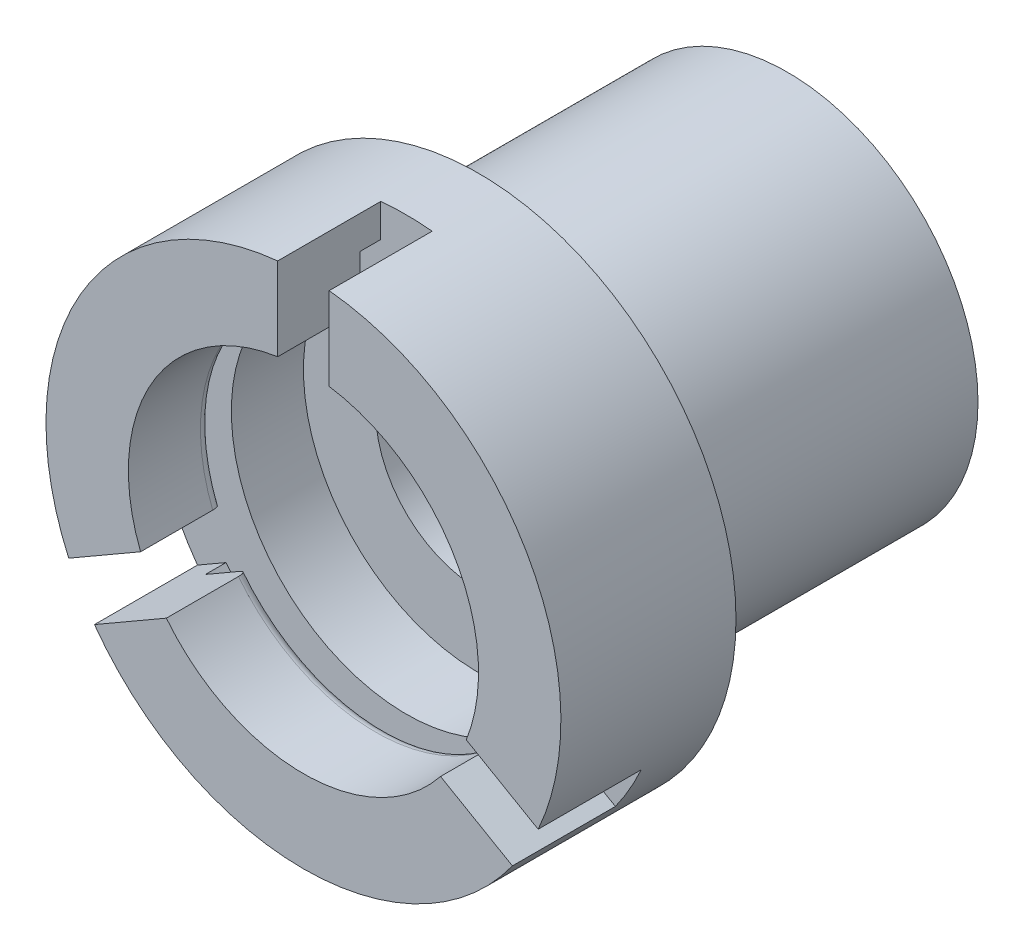
ISO-10303-21;
HEADER;
FILE_DESCRIPTION(('STEP AP214'),'2;1');
FILE_NAME('part.step','',(''),(''),'','','');
FILE_SCHEMA(('AUTOMOTIVE_DESIGN { 1 0 10303 214 1 1 1 1 }'));
ENDSEC;
DATA;
#1=APPLICATION_CONTEXT('core data for automotive mechanical design processes');
#2=APPLICATION_PROTOCOL_DEFINITION('international standard','automotive_design',2000,#1);
#3=PRODUCT_CONTEXT('',#1,'mechanical');
#4=PRODUCT('Part','Part','',(#3));
#5=PRODUCT_RELATED_PRODUCT_CATEGORY('part','',(#4));
#6=PRODUCT_DEFINITION_FORMATION('','',#4);
#7=PRODUCT_DEFINITION_CONTEXT('part definition',#1,'design');
#8=PRODUCT_DEFINITION('design','',#6,#7);
#9=PRODUCT_DEFINITION_SHAPE('','',#8);
#10=(LENGTH_UNIT() NAMED_UNIT(*) SI_UNIT(.MILLI.,.METRE.));
#11=(NAMED_UNIT(*) PLANE_ANGLE_UNIT() SI_UNIT($,.RADIAN.));
#12=(NAMED_UNIT(*) SI_UNIT($,.STERADIAN.) SOLID_ANGLE_UNIT());
#13=UNCERTAINTY_MEASURE_WITH_UNIT(LENGTH_MEASURE(1.E-05),#10,'distance_accuracy_value','');
#14=(GEOMETRIC_REPRESENTATION_CONTEXT(3) GLOBAL_UNCERTAINTY_ASSIGNED_CONTEXT((#13)) GLOBAL_UNIT_ASSIGNED_CONTEXT((#10,
#11,#12)) REPRESENTATION_CONTEXT('',''));
#15=CARTESIAN_POINT('',(0.,0.,0.));
#16=DIRECTION('',(0.,0.,1.));
#17=DIRECTION('',(1.,0.,0.));
#18=AXIS2_PLACEMENT_3D('',#15,#16,#17);
#19=CARTESIAN_POINT('',(0.,0.,4.7));
#20=DIRECTION('',(0.,0.,-1.));
#21=DIRECTION('',(-1.,0.,0.));
#22=AXIS2_PLACEMENT_3D('',#19,#20,#21);
#23=CYLINDRICAL_SURFACE('',#22,1.7);
#24=CARTESIAN_POINT('',(0.,0.,3.7));
#25=DIRECTION('',(0.,0.,1.));
#26=DIRECTION('',(1.,0.,0.));
#27=AXIS2_PLACEMENT_3D('',#24,#25,#26);
#28=CIRCLE('',#27,1.7);
#29=CARTESIAN_POINT('',(1.7,0.,3.7));
#30=VERTEX_POINT('',#29);
#31=EDGE_CURVE('E315',#30,#30,#28,.T.);
#32=ORIENTED_EDGE('',*,*,#31,.T.);
#33=EDGE_LOOP('',(#32));
#34=FACE_BOUND('',#33,.T.);
#35=CARTESIAN_POINT('',(0.,0.,3.));
#36=DIRECTION('',(0.,0.,1.));
#37=DIRECTION('',(1.,0.,0.));
#38=AXIS2_PLACEMENT_3D('',#35,#36,#37);
#39=CIRCLE('',#38,1.7);
#40=CARTESIAN_POINT('',(1.7,0.,3.));
#41=VERTEX_POINT('',#40);
#42=EDGE_CURVE('E310',#41,#41,#39,.F.);
#43=ORIENTED_EDGE('',*,*,#42,.T.);
#44=EDGE_LOOP('',(#43));
#45=FACE_BOUND('',#44,.T.);
#46=ADVANCED_FACE('F37',(#34,#45),#23,.F.);
#47=DIRECTION('',(0.,0.,-1.));
#48=VECTOR('',#47,1.);
#49=CARTESIAN_POINT('',(-1.58123658792108,-0.624252235093888,4.7));
#50=LINE('',#49,#48);
#51=CARTESIAN_POINT('',(-1.58123658792108,-0.624252235093888,4.));
#52=VERTEX_POINT('',#51);
#53=CARTESIAN_POINT('',(-1.58123658792108,-0.624252235093888,4.7));
#54=VERTEX_POINT('',#53);
#55=EDGE_CURVE('E320',#52,#54,#50,.F.);
#56=ORIENTED_EDGE('',*,*,#55,.F.);
#57=CARTESIAN_POINT('',(0.,0.,4.));
#58=DIRECTION('',(0.,0.,1.));
#59=DIRECTION('',(1.,0.,0.));
#60=AXIS2_PLACEMENT_3D('',#57,#58,#59);
#61=CIRCLE('',#60,1.7);
#62=CARTESIAN_POINT('',(-0.25,1.68151717208002,4.));
#63=VERTEX_POINT('',#62);
#64=EDGE_CURVE('E372',#52,#63,#61,.F.);
#65=ORIENTED_EDGE('',*,*,#64,.T.);
#66=DIRECTION('',(0.,0.,-1.));
#67=VECTOR('',#66,1.);
#68=CARTESIAN_POINT('',(-0.25,1.68151717208002,4.7));
#69=LINE('',#68,#67);
#70=CARTESIAN_POINT('',(-0.25,1.68151717208002,4.7));
#71=VERTEX_POINT('',#70);
#72=EDGE_CURVE('E327',#71,#63,#69,.T.);
#73=ORIENTED_EDGE('',*,*,#72,.F.);
#74=CARTESIAN_POINT('',(0.,0.,4.7));
#75=DIRECTION('',(0.,0.,1.));
#76=DIRECTION('',(1.,0.,0.));
#77=AXIS2_PLACEMENT_3D('',#74,#75,#76);
#78=CIRCLE('',#77,1.7);
#79=EDGE_CURVE('E291',#71,#54,#78,.T.);
#80=ORIENTED_EDGE('',*,*,#79,.T.);
#81=EDGE_LOOP('',(#56,#65,#73,#80));
#82=FACE_BOUND('',#81,.T.);
#83=ADVANCED_FACE('F436',(#82),#23,.F.);
#84=DIRECTION('',(0.,0.,-1.));
#85=VECTOR('',#84,1.);
#86=CARTESIAN_POINT('',(1.33123658792106,-1.05726493698613,4.7));
#87=LINE('',#86,#85);
#88=CARTESIAN_POINT('',(1.33123658792106,-1.05726493698613,4.));
#89=VERTEX_POINT('',#88);
#90=CARTESIAN_POINT('',(1.33123658792106,-1.05726493698613,4.7));
#91=VERTEX_POINT('',#90);
#92=EDGE_CURVE('E325',#89,#91,#87,.F.);
#93=ORIENTED_EDGE('',*,*,#92,.F.);
#94=CARTESIAN_POINT('',(0.,0.,4.));
#95=DIRECTION('',(0.,0.,1.));
#96=DIRECTION('',(1.,0.,0.));
#97=AXIS2_PLACEMENT_3D('',#94,#95,#96);
#98=CIRCLE('',#97,1.7);
#99=CARTESIAN_POINT('',(-1.33123658792108,-1.05726493698611,4.));
#100=VERTEX_POINT('',#99);
#101=EDGE_CURVE('E51',#89,#100,#98,.F.);
#102=ORIENTED_EDGE('',*,*,#101,.T.);
#103=DIRECTION('',(0.,0.,-1.));
#104=VECTOR('',#103,1.);
#105=CARTESIAN_POINT('',(-1.33123658792108,-1.05726493698611,4.7));
#106=LINE('',#105,#104);
#107=CARTESIAN_POINT('',(-1.33123658792108,-1.05726493698611,4.7));
#108=VERTEX_POINT('',#107);
#109=EDGE_CURVE('E318',#108,#100,#106,.T.);
#110=ORIENTED_EDGE('',*,*,#109,.F.);
#111=EDGE_CURVE('E290',#108,#91,#78,.T.);
#112=ORIENTED_EDGE('',*,*,#111,.T.);
#113=EDGE_LOOP('',(#93,#102,#110,#112));
#114=FACE_BOUND('',#113,.T.);
#115=ADVANCED_FACE('F403',(#114),#23,.F.);
#116=CARTESIAN_POINT('',(0.,0.,4.7));
#117=DIRECTION('',(0.,0.,1.));
#118=DIRECTION('',(1.,0.,0.));
#119=AXIS2_PLACEMENT_3D('',#116,#117,#118);
#120=PLANE('',#119);
#121=DIRECTION('',(0.,1.,0.));
#122=VECTOR('',#121,1.);
#123=CARTESIAN_POINT('',(0.25,1.58034806292791,4.7));
#124=LINE('',#123,#122);
#125=CARTESIAN_POINT('',(0.25,1.68151717208002,4.7));
#126=VERTEX_POINT('',#125);
#127=CARTESIAN_POINT('',(0.25,2.48746859276655,4.7));
#128=VERTEX_POINT('',#127);
#129=EDGE_CURVE('E241',#126,#128,#124,.T.);
#130=ORIENTED_EDGE('',*,*,#129,.F.);
#131=CARTESIAN_POINT('',(1.58123658792107,-0.624252235093909,4.7));
#132=VERTEX_POINT('',#131);
#133=EDGE_CURVE('E287',#132,#126,#78,.T.);
#134=ORIENTED_EDGE('',*,*,#133,.F.);
#135=DIRECTION('',(-0.866025403784436,0.500000000000004,0.));
#136=VECTOR('',#135,1.);
#137=CARTESIAN_POINT('',(1.4936215693171,-0.573667680517853,4.7));
#138=LINE('',#137,#136);
#139=CARTESIAN_POINT('',(2.27921099245176,-1.02722794543718,4.7));
#140=VERTEX_POINT('',#139);
#141=EDGE_CURVE('E253',#140,#132,#138,.T.);
#142=ORIENTED_EDGE('',*,*,#141,.F.);
#143=CARTESIAN_POINT('',(0.,0.,4.7));
#144=DIRECTION('',(0.,0.,1.));
#145=DIRECTION('',(1.,0.,0.));
#146=AXIS2_PLACEMENT_3D('',#143,#144,#145);
#147=CIRCLE('',#146,2.5);
#148=EDGE_CURVE('E292',#140,#128,#147,.T.);
#149=ORIENTED_EDGE('',*,*,#148,.T.);
#150=EDGE_LOOP('',(#130,#134,#142,#149));
#151=FACE_BOUND('',#150,.T.);
#152=ADVANCED_FACE('F410',(#151),#120,.T.);
#153=DIRECTION('',(0.866025403784436,-0.500000000000004,0.));
#154=VECTOR('',#153,1.);
#155=CARTESIAN_POINT('',(1.2436215693171,-1.00668038241007,4.7));
#156=LINE('',#155,#154);
#157=CARTESIAN_POINT('',(2.02921099245175,-1.46024064732939,4.7));
#158=VERTEX_POINT('',#157);
#159=EDGE_CURVE('E251',#91,#158,#156,.T.);
#160=ORIENTED_EDGE('',*,*,#159,.F.);
#161=ORIENTED_EDGE('',*,*,#111,.F.);
#162=DIRECTION('',(0.866025403784443,0.499999999999992,0.));
#163=VECTOR('',#162,1.);
#164=CARTESIAN_POINT('',(-1.24362156931711,-1.00668038241005,4.7));
#165=LINE('',#164,#163);
#166=CARTESIAN_POINT('',(-2.02921099245177,-1.46024064732937,4.7));
#167=VERTEX_POINT('',#166);
#168=EDGE_CURVE('E237',#167,#108,#165,.T.);
#169=ORIENTED_EDGE('',*,*,#168,.F.);
#170=EDGE_CURVE('E295',#167,#158,#147,.T.);
#171=ORIENTED_EDGE('',*,*,#170,.T.);
#172=EDGE_LOOP('',(#160,#161,#169,#171));
#173=FACE_BOUND('',#172,.T.);
#174=ADVANCED_FACE('F411',(#173),#120,.T.);
#175=CARTESIAN_POINT('',(0.,0.,3.));
#176=DIRECTION('',(0.,0.,1.));
#177=DIRECTION('',(1.,0.,0.));
#178=AXIS2_PLACEMENT_3D('',#175,#176,#177);
#179=PLANE('',#178);
#180=CARTESIAN_POINT('',(0.,0.,3.));
#181=DIRECTION('',(0.,0.,1.));
#182=DIRECTION('',(1.,0.,0.));
#183=AXIS2_PLACEMENT_3D('',#180,#181,#182);
#184=CIRCLE('',#183,1.);
#185=CARTESIAN_POINT('',(1.,0.,3.));
#186=VERTEX_POINT('',#185);
#187=EDGE_CURVE('E300',#186,#186,#184,.T.);
#188=ORIENTED_EDGE('',*,*,#187,.F.);
#189=EDGE_LOOP('',(#188));
#190=FACE_BOUND('',#189,.T.);
#191=ORIENTED_EDGE('',*,*,#42,.F.);
#192=EDGE_LOOP('',(#191));
#193=FACE_BOUND('',#192,.T.);
#194=ADVANCED_FACE('F422',(#190,#193),#179,.T.);
#195=CARTESIAN_POINT('',(0.,0.,0.));
#196=DIRECTION('',(0.,0.,1.));
#197=DIRECTION('',(1.,0.,0.));
#198=AXIS2_PLACEMENT_3D('',#195,#196,#197);
#199=PLANE('',#198);
#200=CARTESIAN_POINT('',(0.,0.,0.));
#201=DIRECTION('',(0.,0.,1.));
#202=DIRECTION('',(1.,0.,0.));
#203=AXIS2_PLACEMENT_3D('',#200,#201,#202);
#204=CIRCLE('',#203,1.85);
#205=CARTESIAN_POINT('',(1.85,0.,0.));
#206=VERTEX_POINT('',#205);
#207=EDGE_CURVE('E303',#206,#206,#204,.T.);
#208=ORIENTED_EDGE('',*,*,#207,.F.);
#209=EDGE_LOOP('',(#208));
#210=FACE_BOUND('',#209,.T.);
#211=CARTESIAN_POINT('',(0.,0.,0.));
#212=DIRECTION('',(0.,0.,1.));
#213=DIRECTION('',(1.,0.,0.));
#214=AXIS2_PLACEMENT_3D('',#211,#212,#213);
#215=CIRCLE('',#214,1.);
#216=CARTESIAN_POINT('',(1.,0.,0.));
#217=VERTEX_POINT('',#216);
#218=EDGE_CURVE('E304',#217,#217,#215,.T.);
#219=ORIENTED_EDGE('',*,*,#218,.T.);
#220=EDGE_LOOP('',(#219));
#221=FACE_BOUND('',#220,.T.);
#222=ADVANCED_FACE('F425',(#210,#221),#199,.F.);
#223=CARTESIAN_POINT('',(0.,0.,3.));
#224=DIRECTION('',(0.,0.,-1.));
#225=DIRECTION('',(-1.,0.,0.));
#226=AXIS2_PLACEMENT_3D('',#223,#224,#225);
#227=CYLINDRICAL_SURFACE('',#226,1.85);
#228=CARTESIAN_POINT('',(0.,0.,3.));
#229=DIRECTION('',(0.,0.,1.));
#230=DIRECTION('',(1.,0.,0.));
#231=AXIS2_PLACEMENT_3D('',#228,#229,#230);
#232=CIRCLE('',#231,1.85);
#233=CARTESIAN_POINT('',(1.85,0.,3.));
#234=VERTEX_POINT('',#233);
#235=EDGE_CURVE('E307',#234,#234,#232,.T.);
#236=ORIENTED_EDGE('',*,*,#235,.F.);
#237=EDGE_LOOP('',(#236));
#238=FACE_BOUND('',#237,.T.);
#239=ORIENTED_EDGE('',*,*,#207,.T.);
#240=EDGE_LOOP('',(#239));
#241=FACE_BOUND('',#240,.T.);
#242=ADVANCED_FACE('F420',(#238,#241),#227,.T.);
#243=CARTESIAN_POINT('',(0.,0.,3.));
#244=DIRECTION('',(0.,0.,-1.));
#245=DIRECTION('',(-1.,0.,0.));
#246=AXIS2_PLACEMENT_3D('',#243,#244,#245);
#247=CYLINDRICAL_SURFACE('',#246,1.);
#248=ORIENTED_EDGE('',*,*,#187,.T.);
#249=EDGE_LOOP('',(#248));
#250=FACE_BOUND('',#249,.T.);
#251=ORIENTED_EDGE('',*,*,#218,.F.);
#252=EDGE_LOOP('',(#251));
#253=FACE_BOUND('',#252,.T.);
#254=ADVANCED_FACE('F408',(#250,#253),#247,.F.);
#255=DIRECTION('',(0.,-1.,0.));
#256=VECTOR('',#255,1.);
#257=CARTESIAN_POINT('',(-0.25,1.58034806292791,4.7));
#258=LINE('',#257,#256);
#259=CARTESIAN_POINT('',(-0.25,2.48746859276655,4.7));
#260=VERTEX_POINT('',#259);
#261=EDGE_CURVE('E244',#260,#71,#258,.T.);
#262=ORIENTED_EDGE('',*,*,#261,.F.);
#263=CARTESIAN_POINT('',(-2.27921099245177,-1.02722794543714,4.7));
#264=VERTEX_POINT('',#263);
#265=EDGE_CURVE('E297',#260,#264,#147,.T.);
#266=ORIENTED_EDGE('',*,*,#265,.T.);
#267=DIRECTION('',(-0.866025403784443,-0.499999999999992,0.));
#268=VECTOR('',#267,1.);
#269=CARTESIAN_POINT('',(-1.4936215693171,-0.573667680517832,4.7));
#270=LINE('',#269,#268);
#271=EDGE_CURVE('E260',#54,#264,#270,.T.);
#272=ORIENTED_EDGE('',*,*,#271,.F.);
#273=ORIENTED_EDGE('',*,*,#79,.F.);
#274=EDGE_LOOP('',(#262,#266,#272,#273));
#275=FACE_BOUND('',#274,.T.);
#276=ADVANCED_FACE('F404',(#275),#120,.T.);
#277=CARTESIAN_POINT('',(0.,0.,3.));
#278=DIRECTION('',(0.,0.,1.));
#279=DIRECTION('',(1.,0.,0.));
#280=AXIS2_PLACEMENT_3D('',#277,#278,#279);
#281=PLANE('',#280);
#282=ORIENTED_EDGE('',*,*,#235,.T.);
#283=EDGE_LOOP('',(#282));
#284=FACE_BOUND('',#283,.T.);
#285=CARTESIAN_POINT('',(0.,0.,3.));
#286=DIRECTION('',(0.,0.,1.));
#287=DIRECTION('',(1.,0.,0.));
#288=AXIS2_PLACEMENT_3D('',#285,#286,#287);
#289=CIRCLE('',#288,2.5);
#290=CARTESIAN_POINT('',(2.5,0.,3.));
#291=VERTEX_POINT('',#290);
#292=EDGE_CURVE('E296',#291,#291,#289,.T.);
#293=ORIENTED_EDGE('',*,*,#292,.F.);
#294=EDGE_LOOP('',(#293));
#295=FACE_BOUND('',#294,.T.);
#296=ADVANCED_FACE('F407',(#284,#295),#281,.F.);
#297=CARTESIAN_POINT('',(0.,0.,4.7));
#298=DIRECTION('',(0.,0.,-1.));
#299=DIRECTION('',(-1.,0.,0.));
#300=AXIS2_PLACEMENT_3D('',#297,#298,#299);
#301=CYLINDRICAL_SURFACE('',#300,2.5);
#302=CARTESIAN_POINT('',(0.,0.,3.7));
#303=DIRECTION('',(0.,0.,1.));
#304=DIRECTION('',(1.,0.,0.));
#305=AXIS2_PLACEMENT_3D('',#302,#303,#304);
#306=CIRCLE('',#305,2.5);
#307=CARTESIAN_POINT('',(0.25,2.48746859276655,3.7));
#308=VERTEX_POINT('',#307);
#309=CARTESIAN_POINT('',(-0.25,2.48746859276655,3.7));
#310=VERTEX_POINT('',#309);
#311=EDGE_CURVE('E279',#308,#310,#306,.T.);
#312=ORIENTED_EDGE('',*,*,#311,.F.);
#313=DIRECTION('',(0.,0.,-1.));
#314=VECTOR('',#313,1.);
#315=CARTESIAN_POINT('',(0.25,2.48746859276655,4.7));
#316=LINE('',#315,#314);
#317=EDGE_CURVE('E284',#308,#128,#316,.F.);
#318=ORIENTED_EDGE('',*,*,#317,.T.);
#319=ORIENTED_EDGE('',*,*,#148,.F.);
#320=DIRECTION('',(0.,0.,-1.));
#321=VECTOR('',#320,1.);
#322=CARTESIAN_POINT('',(2.27921099245176,-1.02722794543718,4.7));
#323=LINE('',#322,#321);
#324=CARTESIAN_POINT('',(2.27921099245176,-1.02722794543718,3.7));
#325=VERTEX_POINT('',#324);
#326=EDGE_CURVE('E273',#140,#325,#323,.T.);
#327=ORIENTED_EDGE('',*,*,#326,.T.);
#328=CARTESIAN_POINT('',(0.,0.,3.7));
#329=DIRECTION('',(0.,0.,1.));
#330=DIRECTION('',(1.,0.,0.));
#331=AXIS2_PLACEMENT_3D('',#328,#329,#330);
#332=CIRCLE('',#331,2.5);
#333=CARTESIAN_POINT('',(2.02921099245175,-1.46024064732939,3.7));
#334=VERTEX_POINT('',#333);
#335=EDGE_CURVE('E271',#334,#325,#332,.T.);
#336=ORIENTED_EDGE('',*,*,#335,.F.);
#337=DIRECTION('',(0.,0.,-1.));
#338=VECTOR('',#337,1.);
#339=CARTESIAN_POINT('',(2.02921099245175,-1.46024064732939,4.7));
#340=LINE('',#339,#338);
#341=EDGE_CURVE('E276',#334,#158,#340,.F.);
#342=ORIENTED_EDGE('',*,*,#341,.T.);
#343=ORIENTED_EDGE('',*,*,#170,.F.);
#344=DIRECTION('',(0.,0.,-1.));
#345=VECTOR('',#344,1.);
#346=CARTESIAN_POINT('',(-2.02921099245177,-1.46024064732937,4.7));
#347=LINE('',#346,#345);
#348=CARTESIAN_POINT('',(-2.02921099245177,-1.46024064732937,3.7));
#349=VERTEX_POINT('',#348);
#350=EDGE_CURVE('E265',#167,#349,#347,.T.);
#351=ORIENTED_EDGE('',*,*,#350,.T.);
#352=CARTESIAN_POINT('',(0.,0.,3.7));
#353=DIRECTION('',(0.,0.,1.));
#354=DIRECTION('',(1.,0.,0.));
#355=AXIS2_PLACEMENT_3D('',#352,#353,#354);
#356=CIRCLE('',#355,2.5);
#357=CARTESIAN_POINT('',(-2.27921099245177,-1.02722794543714,3.7));
#358=VERTEX_POINT('',#357);
#359=EDGE_CURVE('E243',#358,#349,#356,.T.);
#360=ORIENTED_EDGE('',*,*,#359,.F.);
#361=DIRECTION('',(0.,0.,-1.));
#362=VECTOR('',#361,1.);
#363=CARTESIAN_POINT('',(-2.27921099245177,-1.02722794543714,4.7));
#364=LINE('',#363,#362);
#365=EDGE_CURVE('E268',#358,#264,#364,.F.);
#366=ORIENTED_EDGE('',*,*,#365,.T.);
#367=ORIENTED_EDGE('',*,*,#265,.F.);
#368=DIRECTION('',(0.,0.,-1.));
#369=VECTOR('',#368,1.);
#370=CARTESIAN_POINT('',(-0.25,2.48746859276655,4.7));
#371=LINE('',#370,#369);
#372=EDGE_CURVE('E281',#260,#310,#371,.T.);
#373=ORIENTED_EDGE('',*,*,#372,.T.);
#374=EDGE_LOOP('',(#312,#318,#319,#327,#336,#342,#343,#351,#360,#366,#367,#373));
#375=FACE_BOUND('',#374,.T.);
#376=ORIENTED_EDGE('',*,*,#292,.T.);
#377=EDGE_LOOP('',(#376));
#378=FACE_BOUND('',#377,.T.);
#379=ADVANCED_FACE('F401',(#375,#378),#301,.T.);
#380=DIRECTION('',(0.,0.,-1.));
#381=VECTOR('',#380,1.);
#382=CARTESIAN_POINT('',(0.25,1.68151717208002,4.7));
#383=LINE('',#382,#381);
#384=CARTESIAN_POINT('',(0.25,1.68151717208002,4.));
#385=VERTEX_POINT('',#384);
#386=EDGE_CURVE('E330',#385,#126,#383,.F.);
#387=ORIENTED_EDGE('',*,*,#386,.F.);
#388=CARTESIAN_POINT('',(0.,0.,4.));
#389=DIRECTION('',(0.,0.,1.));
#390=DIRECTION('',(1.,0.,0.));
#391=AXIS2_PLACEMENT_3D('',#388,#389,#390);
#392=CIRCLE('',#391,1.7);
#393=CARTESIAN_POINT('',(1.58123658792107,-0.624252235093909,4.));
#394=VERTEX_POINT('',#393);
#395=EDGE_CURVE('E343',#385,#394,#392,.F.);
#396=ORIENTED_EDGE('',*,*,#395,.T.);
#397=DIRECTION('',(0.,0.,-1.));
#398=VECTOR('',#397,1.);
#399=CARTESIAN_POINT('',(1.58123658792107,-0.624252235093909,4.7));
#400=LINE('',#399,#398);
#401=EDGE_CURVE('E322',#132,#394,#400,.T.);
#402=ORIENTED_EDGE('',*,*,#401,.F.);
#403=ORIENTED_EDGE('',*,*,#133,.T.);
#404=EDGE_LOOP('',(#387,#396,#402,#403));
#405=FACE_BOUND('',#404,.T.);
#406=ADVANCED_FACE('F392',(#405),#23,.F.);
#407=CARTESIAN_POINT('',(-1.4936215693171,-0.573667680517832,3.7));
#408=DIRECTION('',(-0.499999999999992,0.866025403784443,0.));
#409=DIRECTION('',(-0.866025403784443,-0.499999999999992,0.));
#410=AXIS2_PLACEMENT_3D('',#407,#408,#409);
#411=PLANE('',#410);
#412=DIRECTION('',(0.866025403784443,0.499999999999992,0.));
#413=VECTOR('',#412,1.);
#414=CARTESIAN_POINT('',(-1.4936215693171,-0.573667680517832,3.9));
#415=LINE('',#414,#413);
#416=CARTESIAN_POINT('',(-2.00180256794902,-0.867066116875017,3.9));
#417=VERTEX_POINT('',#416);
#418=CARTESIAN_POINT('',(-1.6687373481263,-0.674770822552669,3.9));
#419=VERTEX_POINT('',#418);
#420=EDGE_CURVE('E196',#417,#419,#415,.T.);
#421=ORIENTED_EDGE('',*,*,#420,.T.);
#422=CARTESIAN_POINT('',(-1.6687373481263,-0.674770822552669,3.9));
#423=CARTESIAN_POINT('',(-1.66377873255954,-0.671907964520392,3.89999543115095));
#424=CARTESIAN_POINT('',(-1.65882115339714,-0.66904570485645,3.90048200726875));
#425=CARTESIAN_POINT('',(-1.64904829339621,-0.663403341504165,3.90240348412196));
#426=CARTESIAN_POINT('',(-1.64423294010454,-0.660623195984973,3.90383789299062));
#427=CARTESIAN_POINT('',(-1.63487674031498,-0.65522139151788,3.90762218218898));
#428=CARTESIAN_POINT('',(-1.63033604726774,-0.652599821164747,3.90997256890987));
#429=CARTESIAN_POINT('',(-1.6216636383485,-0.647592803540702,3.91552284319186));
#430=CARTESIAN_POINT('',(-1.61753182278532,-0.645207298713061,3.91872252297704));
#431=CARTESIAN_POINT('',(-1.60981255430539,-0.640750576978223,3.92586938342664));
#432=CARTESIAN_POINT('',(-1.60622298231016,-0.638678136620501,3.92981351119226));
#433=CARTESIAN_POINT('',(-1.59967426571053,-0.634897233328862,3.9383487040669));
#434=CARTESIAN_POINT('',(-1.59671522941132,-0.633188832924972,3.94293988009276));
#435=CARTESIAN_POINT('',(-1.59154301392686,-0.630202652922711,3.95259116358786));
#436=CARTESIAN_POINT('',(-1.58932304575518,-0.6289209537012,3.95764642571567));
#437=CARTESIAN_POINT('',(-1.58565928867621,-0.626805682565411,3.96811723045253));
#438=CARTESIAN_POINT('',(-1.5842149250501,-0.625971778837069,3.9735325029426));
#439=CARTESIAN_POINT('',(-1.58253421105055,-0.625001418156996,3.982488667982));
#440=CARTESIAN_POINT('',(-1.58204789575143,-0.624720643888138,3.98596962920034));
#441=CARTESIAN_POINT('',(-1.58139915011762,-0.624346090421821,3.99296653423322));
#442=CARTESIAN_POINT('',(-1.58123625950287,-0.624252045481548,3.99648242116641));
#443=CARTESIAN_POINT('',(-1.58123658792085,-0.624252235093758,3.99999999999994));
#444=B_SPLINE_CURVE_WITH_KNOTS('',3,(#422,#423,#424,#425,#426,#427,#428,#429,#430,#431,#432,
#433,#434,#435,#436,#437,#438,#439,#440,#441,#442,#443),.UNSPECIFIED.,.F.,.F.,(4,2,2,2,2,2,2,2,
2,2,4),(0.,0.0171548590670495,0.0343008228042453,0.0514562790311837,0.0686075421112169,
0.0856899405803555,0.102775270879705,0.11969902380718,0.136610218958827,0.147169670046982,
0.157714082708547),.UNSPECIFIED.);
#445=EDGE_CURVE('E380',#419,#52,#444,.T.);
#446=ORIENTED_EDGE('',*,*,#445,.T.);
#447=ORIENTED_EDGE('',*,*,#55,.T.);
#448=ORIENTED_EDGE('',*,*,#271,.T.);
#449=ORIENTED_EDGE('',*,*,#365,.F.);
#450=DIRECTION('',(-0.866025403784443,-0.499999999999992,0.));
#451=VECTOR('',#450,1.);
#452=CARTESIAN_POINT('',(-1.4936215693171,-0.573667680517832,3.7));
#453=LINE('',#452,#451);
#454=CARTESIAN_POINT('',(-2.00180256794902,-0.867066116875017,3.7));
#455=VERTEX_POINT('',#454);
#456=EDGE_CURVE('E255',#455,#358,#453,.T.);
#457=ORIENTED_EDGE('',*,*,#456,.F.);
#458=DIRECTION('',(0.,0.,-1.));
#459=VECTOR('',#458,1.);
#460=CARTESIAN_POINT('',(-2.00180256794902,-0.867066116875017,0.));
#461=LINE('',#460,#459);
#462=EDGE_CURVE('E227',#455,#417,#461,.F.);
#463=ORIENTED_EDGE('',*,*,#462,.T.);
#464=EDGE_LOOP('',(#421,#446,#447,#448,#449,#457,#463));
#465=FACE_BOUND('',#464,.T.);
#466=ADVANCED_FACE('F388',(#465),#411,.F.);
#467=CARTESIAN_POINT('',(-1.24362156931711,-1.00668038241005,3.7));
#468=DIRECTION('',(0.499999999999992,-0.866025403784443,0.));
#469=DIRECTION('',(0.866025403784443,0.499999999999992,0.));
#470=AXIS2_PLACEMENT_3D('',#467,#468,#469);
#471=PLANE('',#470);
#472=ORIENTED_EDGE('',*,*,#109,.T.);
#473=CARTESIAN_POINT('',(-1.33123658792108,-1.05726493698611,4.));
#474=CARTESIAN_POINT('',(-1.33123221717573,-1.05726241353511,3.9944176603869));
#475=CARTESIAN_POINT('',(-1.33164558022306,-1.05750106880175,3.9888371312626));
#476=CARTESIAN_POINT('',(-1.33327511965196,-1.05844188382968,3.97784067701697));
#477=CARTESIAN_POINT('',(-1.33449040893115,-1.05914353142217,3.97242457691901));
#478=CARTESIAN_POINT('',(-1.3376918675924,-1.06099189444204,3.96190301283224));
#479=CARTESIAN_POINT('',(-1.33967832077176,-1.06213877371987,3.95679766400458));
#480=CARTESIAN_POINT('',(-1.34436123663906,-1.06484245645646,3.94704237204705));
#481=CARTESIAN_POINT('',(-1.34705763923372,-1.06639922522033,3.94239239041855));
#482=CARTESIAN_POINT('',(-1.35309696216338,-1.06988602993949,3.93365316467558));
#483=CARTESIAN_POINT('',(-1.35644300268065,-1.07181786733286,3.92956679643482));
#484=CARTESIAN_POINT('',(-1.36367705331169,-1.07599444841201,3.92209198115698));
#485=CARTESIAN_POINT('',(-1.36756518098707,-1.07823925997204,3.91870368590592));
#486=CARTESIAN_POINT('',(-1.37581513613521,-1.08300237379762,3.91268511838586));
#487=CARTESIAN_POINT('',(-1.38018144755258,-1.0855232648698,3.91006304968453));
#488=CARTESIAN_POINT('',(-1.38923030684386,-1.09074762621748,3.90569517742277));
#489=CARTESIAN_POINT('',(-1.39391271066028,-1.09345101332135,3.90394897770784));
#490=CARTESIAN_POINT('',(-1.40197169642482,-1.0981038709219,3.90177859961285));
#491=CARTESIAN_POINT('',(-1.40530090880494,-1.10002599258575,3.90111207999038));
#492=CARTESIAN_POINT('',(-1.41199876574961,-1.10389300209575,3.90022280547194));
#493=CARTESIAN_POINT('',(-1.41536734871987,-1.10583785438042,3.89999943184489));
#494=CARTESIAN_POINT('',(-1.41873734812615,-1.1077835244448,3.89999999999923));
#495=B_SPLINE_CURVE_WITH_KNOTS('',3,(#473,#474,#475,#476,#477,#478,#479,#480,#481,#482,#483,
#484,#485,#486,#487,#488,#489,#490,#491,#492,#493,#494),.UNSPECIFIED.,.F.,.F.,(4,2,2,2,2,2,2,2,
2,2,4),(0.,0.0167239830146667,0.0334294966624981,0.0501411639704903,0.0668514171826395,
0.083644008427888,0.100440247138212,0.117410226871566,0.134372524166472,0.146053288923408,
0.157717733205391),.UNSPECIFIED.);
#496=CARTESIAN_POINT('',(-1.4187373481263,-1.10778352444489,3.9));
#497=VERTEX_POINT('',#496);
#498=EDGE_CURVE('E11',#100,#497,#495,.T.);
#499=ORIENTED_EDGE('',*,*,#498,.T.);
#500=DIRECTION('',(-0.866025403784443,-0.499999999999992,0.));
#501=VECTOR('',#500,1.);
#502=CARTESIAN_POINT('',(-1.24362156931711,-1.00668038241005,3.9));
#503=LINE('',#502,#501);
#504=CARTESIAN_POINT('',(-1.75180256794903,-1.30007881876724,3.9));
#505=VERTEX_POINT('',#504);
#506=EDGE_CURVE('E235',#497,#505,#503,.T.);
#507=ORIENTED_EDGE('',*,*,#506,.T.);
#508=DIRECTION('',(0.,0.,-1.));
#509=VECTOR('',#508,1.);
#510=CARTESIAN_POINT('',(-1.75180256794903,-1.30007881876724,0.));
#511=LINE('',#510,#509);
#512=CARTESIAN_POINT('',(-1.75180256794903,-1.30007881876724,3.7));
#513=VERTEX_POINT('',#512);
#514=EDGE_CURVE('E224',#505,#513,#511,.T.);
#515=ORIENTED_EDGE('',*,*,#514,.T.);
#516=DIRECTION('',(0.866025403784443,0.499999999999992,0.));
#517=VECTOR('',#516,1.);
#518=CARTESIAN_POINT('',(-1.24362156931711,-1.00668038241005,3.7));
#519=LINE('',#518,#517);
#520=EDGE_CURVE('E257',#349,#513,#519,.T.);
#521=ORIENTED_EDGE('',*,*,#520,.F.);
#522=ORIENTED_EDGE('',*,*,#350,.F.);
#523=ORIENTED_EDGE('',*,*,#168,.T.);
#524=EDGE_LOOP('',(#472,#499,#507,#515,#521,#522,#523));
#525=FACE_BOUND('',#524,.T.);
#526=ADVANCED_FACE('F391',(#525),#471,.F.);
#527=CARTESIAN_POINT('',(1.2436215693171,-1.00668038241007,3.7));
#528=DIRECTION('',(-0.500000000000004,-0.866025403784436,0.));
#529=DIRECTION('',(0.866025403784436,-0.500000000000004,0.));
#530=AXIS2_PLACEMENT_3D('',#527,#528,#529);
#531=PLANE('',#530);
#532=DIRECTION('',(-0.866025403784436,0.500000000000004,0.));
#533=VECTOR('',#532,1.);
#534=CARTESIAN_POINT('',(1.2436215693171,-1.00668038241007,3.9));
#535=LINE('',#534,#533);
#536=CARTESIAN_POINT('',(1.75180256794901,-1.30007881876726,3.9));
#537=VERTEX_POINT('',#536);
#538=CARTESIAN_POINT('',(1.41873734812629,-1.10778352444491,3.9));
#539=VERTEX_POINT('',#538);
#540=EDGE_CURVE('E233',#537,#539,#535,.T.);
#541=ORIENTED_EDGE('',*,*,#540,.T.);
#542=CARTESIAN_POINT('',(1.41873734812629,-1.10778352444491,3.9));
#543=CARTESIAN_POINT('',(1.41377873255953,-1.10492066641263,3.89999543115095));
#544=CARTESIAN_POINT('',(1.40882115339712,-1.10205840674869,3.90048200726875));
#545=CARTESIAN_POINT('',(1.3990482933962,-1.09641604339641,3.90240348412196));
#546=CARTESIAN_POINT('',(1.39423294010453,-1.09363589787721,3.90383789299062));
#547=CARTESIAN_POINT('',(1.38487674031497,-1.08823409341012,3.90762218218898));
#548=CARTESIAN_POINT('',(1.38033604726773,-1.08561252305699,3.90997256890987));
#549=CARTESIAN_POINT('',(1.37166363834849,-1.08060550543294,3.91552284319186));
#550=CARTESIAN_POINT('',(1.36753182278531,-1.0782200006053,3.91872252297704));
#551=CARTESIAN_POINT('',(1.35981255430538,-1.07376327887046,3.92586938342664));
#552=CARTESIAN_POINT('',(1.35622298231014,-1.07169083851274,3.92981351119226));
#553=CARTESIAN_POINT('',(1.34967426571052,-1.0679099352211,3.9383487040669));
#554=CARTESIAN_POINT('',(1.34671522941131,-1.06620153481721,3.94293988009276));
#555=CARTESIAN_POINT('',(1.34154301392685,-1.06321535481495,3.95259116358786));
#556=CARTESIAN_POINT('',(1.33932304575517,-1.06193365559344,3.95764642571567));
#557=CARTESIAN_POINT('',(1.3356592886762,-1.05981838445765,3.96811723045253));
#558=CARTESIAN_POINT('',(1.33421492505009,-1.05898448072931,3.9735325029426));
#559=CARTESIAN_POINT('',(1.33253421105054,-1.05801412004924,3.982488667982));
#560=CARTESIAN_POINT('',(1.33204789575142,-1.05773334578038,3.98596962920034));
#561=CARTESIAN_POINT('',(1.33139915011761,-1.05735879231406,3.99296653423322));
#562=CARTESIAN_POINT('',(1.33123625950286,-1.05726474737379,3.99648242116641));
#563=CARTESIAN_POINT('',(1.33123658792084,-1.057264936986,3.99999999999994));
#564=B_SPLINE_CURVE_WITH_KNOTS('',3,(#542,#543,#544,#545,#546,#547,#548,#549,#550,#551,#552,
#553,#554,#555,#556,#557,#558,#559,#560,#561,#562,#563),.UNSPECIFIED.,.F.,.F.,(4,2,2,2,2,2,2,2,
2,2,4),(0.,0.0171548590670496,0.0343008228042455,0.0514562790311835,0.0686075421112168,
0.0856899405803565,0.102775270879706,0.119699023807181,0.136610218958828,0.147169670046983,
0.157714082708546),.UNSPECIFIED.);
#565=EDGE_CURVE('E65',#539,#89,#564,.T.);
#566=ORIENTED_EDGE('',*,*,#565,.T.);
#567=ORIENTED_EDGE('',*,*,#92,.T.);
#568=ORIENTED_EDGE('',*,*,#159,.T.);
#569=ORIENTED_EDGE('',*,*,#341,.F.);
#570=DIRECTION('',(0.866025403784436,-0.500000000000004,0.));
#571=VECTOR('',#570,1.);
#572=CARTESIAN_POINT('',(1.2436215693171,-1.00668038241007,3.7));
#573=LINE('',#572,#571);
#574=CARTESIAN_POINT('',(1.75180256794901,-1.30007881876726,3.7));
#575=VERTEX_POINT('',#574);
#576=EDGE_CURVE('E246',#575,#334,#573,.T.);
#577=ORIENTED_EDGE('',*,*,#576,.F.);
#578=DIRECTION('',(0.,0.,-1.));
#579=VECTOR('',#578,1.);
#580=CARTESIAN_POINT('',(1.75180256794901,-1.30007881876726,0.));
#581=LINE('',#580,#579);
#582=EDGE_CURVE('E215',#575,#537,#581,.F.);
#583=ORIENTED_EDGE('',*,*,#582,.T.);
#584=EDGE_LOOP('',(#541,#566,#567,#568,#569,#577,#583));
#585=FACE_BOUND('',#584,.T.);
#586=ADVANCED_FACE('F360',(#585),#531,.F.);
#587=CARTESIAN_POINT('',(1.4936215693171,-0.573667680517853,3.7));
#588=DIRECTION('',(0.500000000000004,0.866025403784436,0.));
#589=DIRECTION('',(-0.866025403784436,0.500000000000004,0.));
#590=AXIS2_PLACEMENT_3D('',#587,#588,#589);
#591=PLANE('',#590);
#592=ORIENTED_EDGE('',*,*,#401,.T.);
#593=CARTESIAN_POINT('',(1.58123658792107,-0.624252235093909,4.));
#594=CARTESIAN_POINT('',(1.58123221717572,-0.624249711642907,3.9944176603869));
#595=CARTESIAN_POINT('',(1.58164558022305,-0.624488366909553,3.9888371312626));
#596=CARTESIAN_POINT('',(1.58327511965195,-0.625429181937485,3.97784067701697));
#597=CARTESIAN_POINT('',(1.58449040893114,-0.626130829529967,3.97242457691901));
#598=CARTESIAN_POINT('',(1.58769186759239,-0.627979192549843,3.96190301283224));
#599=CARTESIAN_POINT('',(1.58967832077174,-0.629126071827674,3.95679766400458));
#600=CARTESIAN_POINT('',(1.59436123663905,-0.631829754564257,3.94704237204705));
#601=CARTESIAN_POINT('',(1.59705763923371,-0.633386523328127,3.94239239041854));
#602=CARTESIAN_POINT('',(1.60309696216337,-0.636873328047287,3.93365316467558));
#603=CARTESIAN_POINT('',(1.60644300268064,-0.638805165440656,3.92956679643482));
#604=CARTESIAN_POINT('',(1.61367705331168,-0.642981746519814,3.92209198115698));
#605=CARTESIAN_POINT('',(1.61756518098705,-0.645226558079838,3.91870368590592));
#606=CARTESIAN_POINT('',(1.6258151361352,-0.649989671905422,3.91268511838586));
#607=CARTESIAN_POINT('',(1.63018144755257,-0.652510562977605,3.91006304968453));
#608=CARTESIAN_POINT('',(1.63923030684384,-0.657734924325283,3.90569517742277));
#609=CARTESIAN_POINT('',(1.64391271066026,-0.660438311429147,3.90394897770784));
#610=CARTESIAN_POINT('',(1.65197169642481,-0.665091169029704,3.90177859961285));
#611=CARTESIAN_POINT('',(1.65530090880492,-0.667013290693551,3.90111207999038));
#612=CARTESIAN_POINT('',(1.66199876574959,-0.670880300203549,3.90022280547194));
#613=CARTESIAN_POINT('',(1.66536734871986,-0.67282515248822,3.89999943184489));
#614=CARTESIAN_POINT('',(1.66873734812613,-0.674770822552602,3.89999999999923));
#615=B_SPLINE_CURVE_WITH_KNOTS('',3,(#593,#594,#595,#596,#597,#598,#599,#600,#601,#602,#603,
#604,#605,#606,#607,#608,#609,#610,#611,#612,#613,#614),.UNSPECIFIED.,.F.,.F.,(4,2,2,2,2,2,2,2,
2,2,4),(0.,0.0167239830146658,0.033429496662498,0.0501411639704903,0.0668514171826403,
0.0836440084278879,0.100440247138212,0.117410226871565,0.134372524166472,0.146053288923408,
0.157717733205391),.UNSPECIFIED.);
#616=CARTESIAN_POINT('',(1.66873734812629,-0.674770822552692,3.9));
#617=VERTEX_POINT('',#616);
#618=EDGE_CURVE('E491',#394,#617,#615,.T.);
#619=ORIENTED_EDGE('',*,*,#618,.T.);
#620=DIRECTION('',(0.866025403784436,-0.500000000000004,0.));
#621=VECTOR('',#620,1.);
#622=CARTESIAN_POINT('',(1.4936215693171,-0.573667680517853,3.9));
#623=LINE('',#622,#621);
#624=CARTESIAN_POINT('',(2.00180256794901,-0.867066116875044,3.9));
#625=VERTEX_POINT('',#624);
#626=EDGE_CURVE('E195',#617,#625,#623,.T.);
#627=ORIENTED_EDGE('',*,*,#626,.T.);
#628=DIRECTION('',(0.,0.,-1.));
#629=VECTOR('',#628,1.);
#630=CARTESIAN_POINT('',(2.00180256794901,-0.867066116875044,0.));
#631=LINE('',#630,#629);
#632=CARTESIAN_POINT('',(2.00180256794901,-0.867066116875044,3.7));
#633=VERTEX_POINT('',#632);
#634=EDGE_CURVE('E204',#625,#633,#631,.T.);
#635=ORIENTED_EDGE('',*,*,#634,.T.);
#636=DIRECTION('',(-0.866025403784436,0.500000000000004,0.));
#637=VECTOR('',#636,1.);
#638=CARTESIAN_POINT('',(1.4936215693171,-0.573667680517853,3.7));
#639=LINE('',#638,#637);
#640=EDGE_CURVE('E248',#325,#633,#639,.T.);
#641=ORIENTED_EDGE('',*,*,#640,.F.);
#642=ORIENTED_EDGE('',*,*,#326,.F.);
#643=ORIENTED_EDGE('',*,*,#141,.T.);
#644=EDGE_LOOP('',(#592,#619,#627,#635,#641,#642,#643));
#645=FACE_BOUND('',#644,.T.);
#646=ADVANCED_FACE('F353',(#645),#591,.F.);
#647=CARTESIAN_POINT('',(0.25,1.58034806292791,3.7));
#648=DIRECTION('',(1.,0.,0.));
#649=DIRECTION('',(0.,0.,-1.));
#650=AXIS2_PLACEMENT_3D('',#647,#648,#649);
#651=PLANE('',#650);
#652=DIRECTION('',(0.,-1.,0.));
#653=VECTOR('',#652,1.);
#654=CARTESIAN_POINT('',(0.25,1.58034806292791,3.9));
#655=LINE('',#654,#653);
#656=CARTESIAN_POINT('',(0.25,2.16714493564229,3.9));
#657=VERTEX_POINT('',#656);
#658=CARTESIAN_POINT('',(0.25,1.78255434699759,3.9));
#659=VERTEX_POINT('',#658);
#660=EDGE_CURVE('E186',#657,#659,#655,.T.);
#661=ORIENTED_EDGE('',*,*,#660,.T.);
#662=CARTESIAN_POINT('',(0.25,1.78255434699759,3.9));
#663=CARTESIAN_POINT('',(0.25,1.77682863093303,3.89999543115095));
#664=CARTESIAN_POINT('',(0.25,1.77110411160515,3.90048200726875));
#665=CARTESIAN_POINT('',(0.25,1.75981938490058,3.90240348412196));
#666=CARTESIAN_POINT('',(0.25,1.7542590938622,3.90383789299062));
#667=CARTESIAN_POINT('',(0.25,1.74345548492801,3.90762218218898));
#668=CARTESIAN_POINT('',(0.25,1.73821234422174,3.90997256890987));
#669=CARTESIAN_POINT('',(0.25,1.72819830897365,3.91552284319186));
#670=CARTESIAN_POINT('',(0.25,1.72342729931837,3.91872252297704));
#671=CARTESIAN_POINT('',(0.25,1.7145138558487,3.92586938342664));
#672=CARTESIAN_POINT('',(0.25,1.71036897513325,3.92981351119226));
#673=CARTESIAN_POINT('',(0.25,1.70280716854997,3.9383487040669));
#674=CARTESIAN_POINT('',(0.25,1.69939036774219,3.94293988009276));
#675=CARTESIAN_POINT('',(0.25,1.69341800773767,3.95259116358786));
#676=CARTESIAN_POINT('',(0.25,1.69085460929465,3.95764642571567));
#677=CARTESIAN_POINT('',(0.25,1.68662406702307,3.96811723045253));
#678=CARTESIAN_POINT('',(0.25,1.68495625956639,3.9735325029426));
#679=CARTESIAN_POINT('',(0.25,1.68301553820624,3.982488667982));
#680=CARTESIAN_POINT('',(0.25,1.68245398966852,3.98596962920034));
#681=CARTESIAN_POINT('',(0.25,1.68170488273589,3.99296653423322));
#682=CARTESIAN_POINT('',(0.25,1.68151679285534,3.99648242116641));
#683=CARTESIAN_POINT('',(0.25,1.68151717207976,3.99999999999994));
#684=B_SPLINE_CURVE_WITH_KNOTS('',3,(#662,#663,#664,#665,#666,#667,#668,#669,#670,#671,#672,
#673,#674,#675,#676,#677,#678,#679,#680,#681,#682,#683),.UNSPECIFIED.,.F.,.F.,(4,2,2,2,2,2,2,2,
2,2,4),(0.,0.0171548590670497,0.0343008228042454,0.0514562790311835,0.0686075421112167,
0.0856899405803557,0.102775270879705,0.119699023807181,0.136610218958828,0.147169670046983,
0.157714082708546),.UNSPECIFIED.);
#685=EDGE_CURVE('E335',#659,#385,#684,.T.);
#686=ORIENTED_EDGE('',*,*,#685,.T.);
#687=ORIENTED_EDGE('',*,*,#386,.T.);
#688=ORIENTED_EDGE('',*,*,#129,.T.);
#689=ORIENTED_EDGE('',*,*,#317,.F.);
#690=DIRECTION('',(0.,1.,0.));
#691=VECTOR('',#690,1.);
#692=CARTESIAN_POINT('',(0.25,1.58034806292791,3.7));
#693=LINE('',#692,#691);
#694=CARTESIAN_POINT('',(0.25,2.16714493564229,3.7));
#695=VERTEX_POINT('',#694);
#696=EDGE_CURVE('E212',#695,#308,#693,.T.);
#697=ORIENTED_EDGE('',*,*,#696,.F.);
#698=DIRECTION('',(0.,0.,-1.));
#699=VECTOR('',#698,1.);
#700=CARTESIAN_POINT('',(0.25,2.16714493564229,0.));
#701=LINE('',#700,#699);
#702=EDGE_CURVE('E201',#695,#657,#701,.F.);
#703=ORIENTED_EDGE('',*,*,#702,.T.);
#704=EDGE_LOOP('',(#661,#686,#687,#688,#689,#697,#703));
#705=FACE_BOUND('',#704,.T.);
#706=ADVANCED_FACE('F210',(#705),#651,.F.);
#707=CARTESIAN_POINT('',(-0.25,1.58034806292791,3.7));
#708=DIRECTION('',(-1.,0.,0.));
#709=DIRECTION('',(0.,0.,1.));
#710=AXIS2_PLACEMENT_3D('',#707,#708,#709);
#711=PLANE('',#710);
#712=ORIENTED_EDGE('',*,*,#72,.T.);
#713=CARTESIAN_POINT('',(-0.25,1.68151717208002,4.));
#714=CARTESIAN_POINT('',(-0.25,1.68151212517802,3.9944176603869));
#715=CARTESIAN_POINT('',(-0.25,1.68198943571131,3.9888371312626));
#716=CARTESIAN_POINT('',(-0.25,1.68387106576718,3.97784067701697));
#717=CARTESIAN_POINT('',(-0.25,1.68527436095214,3.97242457691901));
#718=CARTESIAN_POINT('',(-0.25,1.68897108699189,3.96190301283224));
#719=CARTESIAN_POINT('',(-0.25,1.69126484554755,3.95679766400458));
#720=CARTESIAN_POINT('',(-0.25,1.69667221102072,3.94704237204705));
#721=CARTESIAN_POINT('',(-0.25,1.69978574854846,3.94239239041855));
#722=CARTESIAN_POINT('',(-0.25,1.70675935798678,3.93365316467558));
#723=CARTESIAN_POINT('',(-0.25,1.71062303277352,3.92956679643482));
#724=CARTESIAN_POINT('',(-0.25,1.71897619493183,3.92209198115698));
#725=CARTESIAN_POINT('',(-0.25,1.72346581805188,3.91870368590592));
#726=CARTESIAN_POINT('',(-0.25,1.73299204570305,3.91268511838586));
#727=CARTESIAN_POINT('',(-0.25,1.73803382784741,3.91006304968453));
#728=CARTESIAN_POINT('',(-0.25,1.74848255054277,3.90569517742277));
#729=CARTESIAN_POINT('',(-0.25,1.7538893247505,3.90394897770784));
#730=CARTESIAN_POINT('',(-0.25,1.76319503995161,3.90177859961285));
#731=CARTESIAN_POINT('',(-0.25,1.76703928327931,3.90111207999038));
#732=CARTESIAN_POINT('',(-0.25,1.7747733022993,3.90022280547194));
#733=CARTESIAN_POINT('',(-0.25,1.77866300686864,3.89999943184489));
#734=CARTESIAN_POINT('',(-0.25,1.78255434699741,3.89999999999923));
#735=B_SPLINE_CURVE_WITH_KNOTS('',3,(#713,#714,#715,#716,#717,#718,#719,#720,#721,#722,#723,
#724,#725,#726,#727,#728,#729,#730,#731,#732,#733,#734),.UNSPECIFIED.,.F.,.F.,(4,2,2,2,2,2,2,2,
2,2,4),(0.,0.0167239830146667,0.033429496662498,0.0501411639704904,0.0668514171826394,
0.0836440084278879,0.100440247138212,0.117410226871565,0.134372524166472,0.146053288923408,
0.157717733205391),.UNSPECIFIED.);
#736=CARTESIAN_POINT('',(-0.25,1.78255434699759,3.9));
#737=VERTEX_POINT('',#736);
#738=EDGE_CURVE('E364',#63,#737,#735,.T.);
#739=ORIENTED_EDGE('',*,*,#738,.T.);
#740=DIRECTION('',(0.,1.,0.));
#741=VECTOR('',#740,1.);
#742=CARTESIAN_POINT('',(-0.25,1.58034806292791,3.9));
#743=LINE('',#742,#741);
#744=CARTESIAN_POINT('',(-0.25,2.16714493564229,3.9));
#745=VERTEX_POINT('',#744);
#746=EDGE_CURVE('E332',#737,#745,#743,.T.);
#747=ORIENTED_EDGE('',*,*,#746,.T.);
#748=DIRECTION('',(0.,0.,-1.));
#749=VECTOR('',#748,1.);
#750=CARTESIAN_POINT('',(-0.25,2.16714493564229,0.));
#751=LINE('',#750,#749);
#752=CARTESIAN_POINT('',(-0.25,2.16714493564229,3.7));
#753=VERTEX_POINT('',#752);
#754=EDGE_CURVE('E213',#745,#753,#751,.T.);
#755=ORIENTED_EDGE('',*,*,#754,.T.);
#756=DIRECTION('',(0.,-1.,0.));
#757=VECTOR('',#756,1.);
#758=CARTESIAN_POINT('',(-0.25,1.58034806292791,3.7));
#759=LINE('',#758,#757);
#760=EDGE_CURVE('E238',#310,#753,#759,.T.);
#761=ORIENTED_EDGE('',*,*,#760,.F.);
#762=ORIENTED_EDGE('',*,*,#372,.F.);
#763=ORIENTED_EDGE('',*,*,#261,.T.);
#764=EDGE_LOOP('',(#712,#739,#747,#755,#761,#762,#763));
#765=FACE_BOUND('',#764,.T.);
#766=ADVANCED_FACE('F352',(#765),#711,.F.);
#767=CARTESIAN_POINT('',(0.,0.,3.7));
#768=DIRECTION('',(0.,0.,1.));
#769=DIRECTION('',(1.,0.,0.));
#770=AXIS2_PLACEMENT_3D('',#767,#768,#769);
#771=PLANE('',#770);
#772=CARTESIAN_POINT('',(0.,0.,3.7));
#773=DIRECTION('',(0.,0.,-1.));
#774=DIRECTION('',(-1.,0.,0.));
#775=AXIS2_PLACEMENT_3D('',#772,#773,#774);
#776=CIRCLE('',#775,2.18151717208002);
#777=EDGE_CURVE('E205',#455,#753,#776,.T.);
#778=ORIENTED_EDGE('',*,*,#777,.F.);
#779=ORIENTED_EDGE('',*,*,#456,.T.);
#780=ORIENTED_EDGE('',*,*,#359,.T.);
#781=ORIENTED_EDGE('',*,*,#520,.T.);
#782=EDGE_CURVE('E463',#575,#513,#776,.T.);
#783=ORIENTED_EDGE('',*,*,#782,.F.);
#784=ORIENTED_EDGE('',*,*,#576,.T.);
#785=ORIENTED_EDGE('',*,*,#335,.T.);
#786=ORIENTED_EDGE('',*,*,#640,.T.);
#787=EDGE_CURVE('E218',#695,#633,#776,.T.);
#788=ORIENTED_EDGE('',*,*,#787,.F.);
#789=ORIENTED_EDGE('',*,*,#696,.T.);
#790=ORIENTED_EDGE('',*,*,#311,.T.);
#791=ORIENTED_EDGE('',*,*,#760,.T.);
#792=EDGE_LOOP('',(#778,#779,#780,#781,#783,#784,#785,#786,#788,#789,#790,#791));
#793=FACE_BOUND('',#792,.T.);
#794=ORIENTED_EDGE('',*,*,#31,.F.);
#795=EDGE_LOOP('',(#794));
#796=FACE_BOUND('',#795,.T.);
#797=ADVANCED_FACE('F354',(#793,#796),#771,.T.);
#798=CARTESIAN_POINT('',(0.,1.68151717208002,3.9));
#799=DIRECTION('',(0.,0.,1.));
#800=DIRECTION('',(1.,0.,0.));
#801=AXIS2_PLACEMENT_3D('',#798,#799,#800);
#802=PLANE('',#801);
#803=ORIENTED_EDGE('',*,*,#746,.F.);
#804=CARTESIAN_POINT('',(0.,0.,3.9));
#805=DIRECTION('',(0.,0.,1.));
#806=DIRECTION('',(1.,0.,0.));
#807=AXIS2_PLACEMENT_3D('',#804,#805,#806);
#808=CIRCLE('',#807,1.8);
#809=EDGE_CURVE('E387',#737,#419,#808,.T.);
#810=ORIENTED_EDGE('',*,*,#809,.T.);
#811=ORIENTED_EDGE('',*,*,#420,.F.);
#812=CARTESIAN_POINT('',(0.,0.,3.9));
#813=DIRECTION('',(0.,0.,-1.));
#814=DIRECTION('',(-1.,0.,0.));
#815=AXIS2_PLACEMENT_3D('',#812,#813,#814);
#816=CIRCLE('',#815,2.18151717208002);
#817=EDGE_CURVE('E208',#417,#745,#816,.T.);
#818=ORIENTED_EDGE('',*,*,#817,.T.);
#819=EDGE_LOOP('',(#803,#810,#811,#818));
#820=FACE_BOUND('',#819,.T.);
#821=ADVANCED_FACE('F448',(#820),#802,.F.);
#822=CARTESIAN_POINT('',(0.,0.,0.));
#823=DIRECTION('',(0.,0.,-1.));
#824=DIRECTION('',(-1.,0.,0.));
#825=AXIS2_PLACEMENT_3D('',#822,#823,#824);
#826=CYLINDRICAL_SURFACE('',#825,2.18151717208002);
#827=ORIENTED_EDGE('',*,*,#777,.T.);
#828=ORIENTED_EDGE('',*,*,#754,.F.);
#829=ORIENTED_EDGE('',*,*,#817,.F.);
#830=ORIENTED_EDGE('',*,*,#462,.F.);
#831=EDGE_LOOP('',(#827,#828,#829,#830));
#832=FACE_BOUND('',#831,.T.);
#833=ADVANCED_FACE('F453',(#832),#826,.F.);
#834=ORIENTED_EDGE('',*,*,#626,.F.);
#835=CARTESIAN_POINT('',(0.,0.,3.9));
#836=DIRECTION('',(0.,0.,1.));
#837=DIRECTION('',(1.,0.,0.));
#838=AXIS2_PLACEMENT_3D('',#835,#836,#837);
#839=CIRCLE('',#838,1.8);
#840=EDGE_CURVE('E192',#617,#659,#839,.T.);
#841=ORIENTED_EDGE('',*,*,#840,.T.);
#842=ORIENTED_EDGE('',*,*,#660,.F.);
#843=EDGE_CURVE('E190',#657,#625,#816,.T.);
#844=ORIENTED_EDGE('',*,*,#843,.T.);
#845=EDGE_LOOP('',(#834,#841,#842,#844));
#846=FACE_BOUND('',#845,.T.);
#847=ADVANCED_FACE('F189',(#846),#802,.F.);
#848=ORIENTED_EDGE('',*,*,#843,.F.);
#849=ORIENTED_EDGE('',*,*,#702,.F.);
#850=ORIENTED_EDGE('',*,*,#787,.T.);
#851=ORIENTED_EDGE('',*,*,#634,.F.);
#852=EDGE_LOOP('',(#848,#849,#850,#851));
#853=FACE_BOUND('',#852,.T.);
#854=ADVANCED_FACE('F200',(#853),#826,.F.);
#855=ORIENTED_EDGE('',*,*,#506,.F.);
#856=CARTESIAN_POINT('',(0.,0.,3.9));
#857=DIRECTION('',(0.,0.,1.));
#858=DIRECTION('',(1.,0.,0.));
#859=AXIS2_PLACEMENT_3D('',#856,#857,#858);
#860=CIRCLE('',#859,1.8);
#861=EDGE_CURVE('E371',#497,#539,#860,.T.);
#862=ORIENTED_EDGE('',*,*,#861,.T.);
#863=ORIENTED_EDGE('',*,*,#540,.F.);
#864=EDGE_CURVE('E206',#537,#505,#816,.T.);
#865=ORIENTED_EDGE('',*,*,#864,.T.);
#866=EDGE_LOOP('',(#855,#862,#863,#865));
#867=FACE_BOUND('',#866,.T.);
#868=ADVANCED_FACE('F456',(#867),#802,.F.);
#869=ORIENTED_EDGE('',*,*,#864,.F.);
#870=ORIENTED_EDGE('',*,*,#582,.F.);
#871=ORIENTED_EDGE('',*,*,#782,.T.);
#872=ORIENTED_EDGE('',*,*,#514,.F.);
#873=EDGE_LOOP('',(#869,#870,#871,#872));
#874=FACE_BOUND('',#873,.T.);
#875=ADVANCED_FACE('F479',(#874),#826,.F.);
#876=CARTESIAN_POINT('',(0.,0.,4.));
#877=DIRECTION('',(0.,0.,1.));
#878=DIRECTION('',(1.,0.,0.));
#879=AXIS2_PLACEMENT_3D('',#876,#877,#878);
#880=TOROIDAL_SURFACE('',#879,1.8,0.1);
#881=ORIENTED_EDGE('',*,*,#618,.F.);
#882=ORIENTED_EDGE('',*,*,#395,.F.);
#883=ORIENTED_EDGE('',*,*,#685,.F.);
#884=ORIENTED_EDGE('',*,*,#840,.F.);
#885=EDGE_LOOP('',(#881,#882,#883,#884));
#886=FACE_BOUND('',#885,.T.);
#887=ADVANCED_FACE('F345',(#886),#880,.T.);
#888=CARTESIAN_POINT('',(0.,0.,4.));
#889=DIRECTION('',(0.,0.,1.));
#890=DIRECTION('',(1.,0.,0.));
#891=AXIS2_PLACEMENT_3D('',#888,#889,#890);
#892=TOROIDAL_SURFACE('',#891,1.8,0.1);
#893=ORIENTED_EDGE('',*,*,#738,.F.);
#894=ORIENTED_EDGE('',*,*,#64,.F.);
#895=ORIENTED_EDGE('',*,*,#445,.F.);
#896=ORIENTED_EDGE('',*,*,#809,.F.);
#897=EDGE_LOOP('',(#893,#894,#895,#896));
#898=FACE_BOUND('',#897,.T.);
#899=ADVANCED_FACE('F375',(#898),#892,.T.);
#900=CARTESIAN_POINT('',(0.,0.,4.));
#901=DIRECTION('',(0.,0.,1.));
#902=DIRECTION('',(1.,0.,0.));
#903=AXIS2_PLACEMENT_3D('',#900,#901,#902);
#904=TOROIDAL_SURFACE('',#903,1.8,0.1);
#905=ORIENTED_EDGE('',*,*,#498,.F.);
#906=ORIENTED_EDGE('',*,*,#101,.F.);
#907=ORIENTED_EDGE('',*,*,#565,.F.);
#908=ORIENTED_EDGE('',*,*,#861,.F.);
#909=EDGE_LOOP('',(#905,#906,#907,#908));
#910=FACE_BOUND('',#909,.T.);
#911=ADVANCED_FACE('F39',(#910),#904,.T.);
#912=CLOSED_SHELL('',(#46,#83,#115,#152,#174,#194,#222,#242,#254,#276,#296,#379,#406,#466,#526,
#586,#646,#706,#766,#797,#821,#833,#847,#854,#868,#875,#887,#899,#911));
#913=MANIFOLD_SOLID_BREP('B2',#912);
#914=ADVANCED_BREP_SHAPE_REPRESENTATION('',(#18,#913),#14);
#915=SHAPE_DEFINITION_REPRESENTATION(#9,#914);
ENDSEC;
END-ISO-10303-21;
